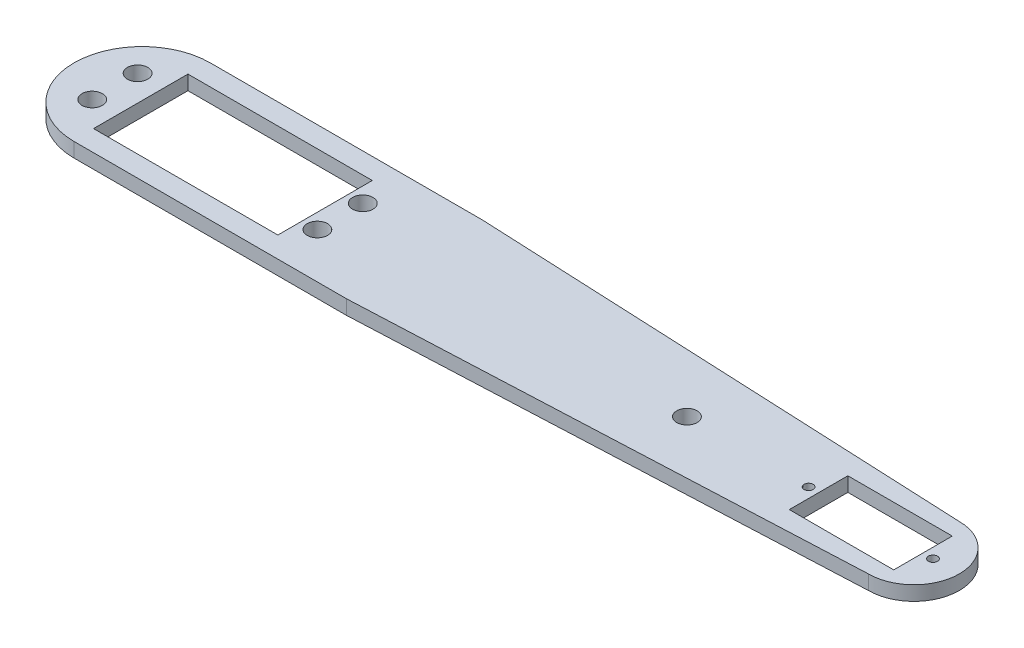
ISO-10303-21;
HEADER;
FILE_DESCRIPTION(('STEP AP214'),'2;1');
FILE_NAME('part.step','',(''),(''),'','','');
FILE_SCHEMA(('AUTOMOTIVE_DESIGN { 1 0 10303 214 1 1 1 1 }'));
ENDSEC;
DATA;
#1=APPLICATION_CONTEXT('core data for automotive mechanical design processes');
#2=APPLICATION_PROTOCOL_DEFINITION('international standard','automotive_design',2000,#1);
#3=PRODUCT_CONTEXT('',#1,'mechanical');
#4=PRODUCT('Part','Part','',(#3));
#5=PRODUCT_RELATED_PRODUCT_CATEGORY('part','',(#4));
#6=PRODUCT_DEFINITION_FORMATION('','',#4);
#7=PRODUCT_DEFINITION_CONTEXT('part definition',#1,'design');
#8=PRODUCT_DEFINITION('design','',#6,#7);
#9=PRODUCT_DEFINITION_SHAPE('','',#8);
#10=(LENGTH_UNIT() NAMED_UNIT(*) SI_UNIT(.MILLI.,.METRE.));
#11=(NAMED_UNIT(*) PLANE_ANGLE_UNIT() SI_UNIT($,.RADIAN.));
#12=(NAMED_UNIT(*) SI_UNIT($,.STERADIAN.) SOLID_ANGLE_UNIT());
#13=UNCERTAINTY_MEASURE_WITH_UNIT(LENGTH_MEASURE(1.E-05),#10,'distance_accuracy_value','');
#14=(GEOMETRIC_REPRESENTATION_CONTEXT(3) GLOBAL_UNCERTAINTY_ASSIGNED_CONTEXT((#13)) GLOBAL_UNIT_ASSIGNED_CONTEXT((#10,
#11,#12)) REPRESENTATION_CONTEXT('',''));
#15=CARTESIAN_POINT('',(0.,0.,0.));
#16=DIRECTION('',(0.,0.,1.));
#17=DIRECTION('',(1.,0.,0.));
#18=AXIS2_PLACEMENT_3D('',#15,#16,#17);
#19=CARTESIAN_POINT('',(-162.387355879804,3.175,-2.24465289077099));
#20=DIRECTION('',(0.,1.,0.));
#21=DIRECTION('',(0.,0.,1.));
#22=AXIS2_PLACEMENT_3D('',#19,#20,#21);
#23=PLANE('',#22);
#24=CARTESIAN_POINT('',(11.812644120196,3.175,-2.244652890771));
#25=DIRECTION('',(0.,1.,0.));
#26=DIRECTION('',(0.,0.,1.));
#27=AXIS2_PLACEMENT_3D('',#24,#25,#26);
#28=CIRCLE('',#27,1.);
#29=CARTESIAN_POINT('',(11.812644120196,3.175,-1.244652890771));
#30=VERTEX_POINT('',#29);
#31=EDGE_CURVE('E383',#30,#30,#28,.T.);
#32=ORIENTED_EDGE('',*,*,#31,.F.);
#33=EDGE_LOOP('',(#32));
#34=FACE_BOUND('',#33,.T.);
#35=DIRECTION('',(-1.,0.,0.));
#36=VECTOR('',#35,1.);
#37=CARTESIAN_POINT('',(-13.387355879804,3.175,-8.69465289077099));
#38=LINE('',#37,#36);
#39=CARTESIAN_POINT('',(9.61264412019603,3.175,-8.69465289077099));
#40=VERTEX_POINT('',#39);
#41=CARTESIAN_POINT('',(-13.387355879804,3.175,-8.69465289077099));
#42=VERTEX_POINT('',#41);
#43=EDGE_CURVE('E144',#40,#42,#38,.T.);
#44=ORIENTED_EDGE('',*,*,#43,.F.);
#45=DIRECTION('',(0.,0.,-1.));
#46=VECTOR('',#45,1.);
#47=CARTESIAN_POINT('',(9.61264412019603,3.175,-8.69465289077099));
#48=LINE('',#47,#46);
#49=CARTESIAN_POINT('',(9.61264412019603,3.175,4.20534710922901));
#50=VERTEX_POINT('',#49);
#51=EDGE_CURVE('E136',#50,#40,#48,.T.);
#52=ORIENTED_EDGE('',*,*,#51,.F.);
#53=DIRECTION('',(1.,0.,0.));
#54=VECTOR('',#53,1.);
#55=CARTESIAN_POINT('',(-13.387355879804,3.175,4.20534710922901));
#56=LINE('',#55,#54);
#57=CARTESIAN_POINT('',(-13.387355879804,3.175,4.20534710922901));
#58=VERTEX_POINT('',#57);
#59=EDGE_CURVE('E159',#58,#50,#56,.T.);
#60=ORIENTED_EDGE('',*,*,#59,.F.);
#61=DIRECTION('',(0.,0.,1.));
#62=VECTOR('',#61,1.);
#63=CARTESIAN_POINT('',(-13.387355879804,3.175,-8.69465289077099));
#64=LINE('',#63,#62);
#65=EDGE_CURVE('E157',#42,#58,#64,.T.);
#66=ORIENTED_EDGE('',*,*,#65,.F.);
#67=EDGE_LOOP('',(#44,#52,#60,#66));
#68=FACE_BOUND('',#67,.T.);
#69=CARTESIAN_POINT('',(-118.787355879804,3.175,2.75534710922901));
#70=DIRECTION('',(0.,1.,0.));
#71=DIRECTION('',(0.,0.,1.));
#72=AXIS2_PLACEMENT_3D('',#69,#70,#71);
#73=CIRCLE('',#72,2.25);
#74=CARTESIAN_POINT('',(-118.787355879804,3.175,5.00534710922901));
#75=VERTEX_POINT('',#74);
#76=EDGE_CURVE('E175',#75,#75,#73,.T.);
#77=ORIENTED_EDGE('',*,*,#76,.F.);
#78=EDGE_LOOP('',(#77));
#79=FACE_BOUND('',#78,.T.);
#80=CARTESIAN_POINT('',(-168.387355879804,3.175,-7.24465289077099));
#81=DIRECTION('',(0.,1.,0.));
#82=DIRECTION('',(0.,0.,1.));
#83=AXIS2_PLACEMENT_3D('',#80,#81,#82);
#84=CIRCLE('',#83,2.25000000000001);
#85=CARTESIAN_POINT('',(-168.387355879804,3.175,-4.99465289077098));
#86=VERTEX_POINT('',#85);
#87=EDGE_CURVE('E187',#86,#86,#84,.T.);
#88=ORIENTED_EDGE('',*,*,#87,.F.);
#89=EDGE_LOOP('',(#88));
#90=FACE_BOUND('',#89,.T.);
#91=DIRECTION('',(1.,0.,0.));
#92=VECTOR('',#91,1.);
#93=CARTESIAN_POINT('',(-162.692621678717,3.175,8.15534710922901));
#94=LINE('',#93,#92);
#95=CARTESIAN_POINT('',(-162.692621678717,3.175,8.15534710922901));
#96=VERTEX_POINT('',#95);
#97=CARTESIAN_POINT('',(-122.092621678717,3.175,8.15534710922901));
#98=VERTEX_POINT('',#97);
#99=EDGE_CURVE('E201',#96,#98,#94,.T.);
#100=ORIENTED_EDGE('',*,*,#99,.F.);
#101=DIRECTION('',(0.,0.,1.));
#102=VECTOR('',#101,1.);
#103=CARTESIAN_POINT('',(-162.692621678717,3.175,8.15534710922901));
#104=LINE('',#103,#102);
#105=CARTESIAN_POINT('',(-162.692621678717,3.175,-12.644652890771));
#106=VERTEX_POINT('',#105);
#107=EDGE_CURVE('E199',#106,#96,#104,.T.);
#108=ORIENTED_EDGE('',*,*,#107,.F.);
#109=DIRECTION('',(-1.,0.,0.));
#110=VECTOR('',#109,1.);
#111=CARTESIAN_POINT('',(-162.692621678717,3.175,-12.644652890771));
#112=LINE('',#111,#110);
#113=CARTESIAN_POINT('',(-122.092621678717,3.175,-12.644652890771));
#114=VERTEX_POINT('',#113);
#115=EDGE_CURVE('E207',#114,#106,#112,.T.);
#116=ORIENTED_EDGE('',*,*,#115,.F.);
#117=DIRECTION('',(0.,0.,-1.));
#118=VECTOR('',#117,1.);
#119=CARTESIAN_POINT('',(-122.092621678717,3.175,8.15534710922901));
#120=LINE('',#119,#118);
#121=EDGE_CURVE('E204',#98,#114,#120,.T.);
#122=ORIENTED_EDGE('',*,*,#121,.F.);
#123=EDGE_LOOP('',(#100,#108,#116,#122));
#124=FACE_BOUND('',#123,.T.);
#125=CARTESIAN_POINT('',(-162.387355879804,3.175,-2.24465289077099));
#126=DIRECTION('',(0.,1.,0.));
#127=DIRECTION('',(0.,0.,1.));
#128=AXIS2_PLACEMENT_3D('',#125,#126,#127);
#129=CIRCLE('',#128,15.);
#130=CARTESIAN_POINT('',(-162.387355879804,3.175,-17.244652890771));
#131=VERTEX_POINT('',#130);
#132=CARTESIAN_POINT('',(-162.387355879804,3.175,12.755347109229));
#133=VERTEX_POINT('',#132);
#134=EDGE_CURVE('E230',#131,#133,#129,.T.);
#135=ORIENTED_EDGE('',*,*,#134,.T.);
#136=DIRECTION('',(1.,0.,0.));
#137=VECTOR('',#136,1.);
#138=CARTESIAN_POINT('',(-162.387355879804,3.175,12.755347109229));
#139=LINE('',#138,#137);
#140=CARTESIAN_POINT('',(-102.387355879804,3.175,12.755347109229));
#141=VERTEX_POINT('',#140);
#142=EDGE_CURVE('E233',#133,#141,#139,.T.);
#143=ORIENTED_EDGE('',*,*,#142,.T.);
#144=DIRECTION('',(0.9989685402103,0.,-0.04540766091865));
#145=VECTOR('',#144,1.);
#146=CARTESIAN_POINT('',(-102.387355879804,3.175,12.755347109229));
#147=LINE('',#146,#145);
#148=CARTESIAN_POINT('',(7.61264412019603,3.175,7.75534710922901));
#149=VERTEX_POINT('',#148);
#150=EDGE_CURVE('E236',#141,#149,#147,.T.);
#151=ORIENTED_EDGE('',*,*,#150,.T.);
#152=CARTESIAN_POINT('',(7.61264412019603,3.175,-2.24465289077099));
#153=DIRECTION('',(0.,1.,0.));
#154=DIRECTION('',(0.,0.,1.));
#155=AXIS2_PLACEMENT_3D('',#152,#153,#154);
#156=CIRCLE('',#155,10.);
#157=CARTESIAN_POINT('',(7.61264412019603,3.175,-12.244652890771));
#158=VERTEX_POINT('',#157);
#159=EDGE_CURVE('E238',#149,#158,#156,.T.);
#160=ORIENTED_EDGE('',*,*,#159,.T.);
#161=DIRECTION('',(-0.998968540210299,0.,-0.04540766091865));
#162=VECTOR('',#161,1.);
#163=CARTESIAN_POINT('',(-102.387355879804,3.175,-17.244652890771));
#164=LINE('',#163,#162);
#165=CARTESIAN_POINT('',(-102.387355879804,3.175,-17.244652890771));
#166=VERTEX_POINT('',#165);
#167=EDGE_CURVE('E240',#158,#166,#164,.T.);
#168=ORIENTED_EDGE('',*,*,#167,.T.);
#169=DIRECTION('',(-1.,0.,0.));
#170=VECTOR('',#169,1.);
#171=CARTESIAN_POINT('',(-162.387355879804,3.175,-17.244652890771));
#172=LINE('',#171,#170);
#173=EDGE_CURVE('E242',#166,#131,#172,.T.);
#174=ORIENTED_EDGE('',*,*,#173,.T.);
#175=EDGE_LOOP('',(#135,#143,#151,#160,#168,#174));
#176=FACE_BOUND('',#175,.T.);
#177=CARTESIAN_POINT('',(-168.387355879804,3.175,2.75534710922901));
#178=DIRECTION('',(0.,1.,0.));
#179=DIRECTION('',(0.,0.,1.));
#180=AXIS2_PLACEMENT_3D('',#177,#178,#179);
#181=CIRCLE('',#180,2.25000000000001);
#182=CARTESIAN_POINT('',(-168.387355879804,3.175,5.00534710922902));
#183=VERTEX_POINT('',#182);
#184=EDGE_CURVE('E193',#183,#183,#181,.T.);
#185=ORIENTED_EDGE('',*,*,#184,.F.);
#186=EDGE_LOOP('',(#185));
#187=FACE_BOUND('',#186,.T.);
#188=CARTESIAN_POINT('',(-118.787355879804,3.175,-7.24465289077099));
#189=DIRECTION('',(0.,1.,0.));
#190=DIRECTION('',(0.,0.,1.));
#191=AXIS2_PLACEMENT_3D('',#188,#189,#190);
#192=CIRCLE('',#191,2.25);
#193=CARTESIAN_POINT('',(-118.787355879804,3.175,-4.994652890771));
#194=VERTEX_POINT('',#193);
#195=EDGE_CURVE('E181',#194,#194,#192,.T.);
#196=ORIENTED_EDGE('',*,*,#195,.F.);
#197=EDGE_LOOP('',(#196));
#198=FACE_BOUND('',#197,.T.);
#199=CARTESIAN_POINT('',(-15.587355879804,3.175,-2.24465289077099));
#200=DIRECTION('',(0.,1.,0.));
#201=DIRECTION('',(0.,0.,1.));
#202=AXIS2_PLACEMENT_3D('',#199,#200,#201);
#203=CIRCLE('',#202,1.);
#204=CARTESIAN_POINT('',(-15.587355879804,3.175,-1.24465289077099));
#205=VERTEX_POINT('',#204);
#206=EDGE_CURVE('E165',#205,#205,#203,.T.);
#207=ORIENTED_EDGE('',*,*,#206,.F.);
#208=EDGE_LOOP('',(#207));
#209=FACE_BOUND('',#208,.T.);
#210=CARTESIAN_POINT('',(-42.387355879804,3.175,-2.24465289077099));
#211=DIRECTION('',(0.,1.,0.));
#212=DIRECTION('',(0.,0.,1.));
#213=AXIS2_PLACEMENT_3D('',#210,#211,#212);
#214=CIRCLE('',#213,2.25);
#215=CARTESIAN_POINT('',(-42.387355879804,3.175,0.00534710922901142));
#216=VERTEX_POINT('',#215);
#217=EDGE_CURVE('E374',#216,#216,#214,.T.);
#218=ORIENTED_EDGE('',*,*,#217,.F.);
#219=EDGE_LOOP('',(#218));
#220=FACE_BOUND('',#219,.T.);
#221=ADVANCED_FACE('F35',(#34,#68,#79,#90,#124,#176,#187,#198,#209,#220),#23,.T.);
#222=CARTESIAN_POINT('',(-162.387355879804,0.,-2.24465289077099));
#223=DIRECTION('',(0.,1.,0.));
#224=DIRECTION('',(0.,0.,1.));
#225=AXIS2_PLACEMENT_3D('',#222,#223,#224);
#226=PLANE('',#225);
#227=CARTESIAN_POINT('',(-118.787355879804,0.,2.75534710922901));
#228=DIRECTION('',(0.,1.,0.));
#229=DIRECTION('',(0.,0.,1.));
#230=AXIS2_PLACEMENT_3D('',#227,#228,#229);
#231=CIRCLE('',#230,2.25);
#232=CARTESIAN_POINT('',(-118.787355879804,0.,5.00534710922901));
#233=VERTEX_POINT('',#232);
#234=EDGE_CURVE('E152',#233,#233,#231,.T.);
#235=ORIENTED_EDGE('',*,*,#234,.T.);
#236=EDGE_LOOP('',(#235));
#237=FACE_BOUND('',#236,.T.);
#238=CARTESIAN_POINT('',(-118.787355879804,0.,-7.24465289077099));
#239=DIRECTION('',(0.,1.,0.));
#240=DIRECTION('',(0.,0.,1.));
#241=AXIS2_PLACEMENT_3D('',#238,#239,#240);
#242=CIRCLE('',#241,2.25);
#243=CARTESIAN_POINT('',(-118.787355879804,0.,-4.994652890771));
#244=VERTEX_POINT('',#243);
#245=EDGE_CURVE('E178',#244,#244,#242,.T.);
#246=ORIENTED_EDGE('',*,*,#245,.T.);
#247=EDGE_LOOP('',(#246));
#248=FACE_BOUND('',#247,.T.);
#249=CARTESIAN_POINT('',(-168.387355879804,0.,-7.24465289077099));
#250=DIRECTION('',(0.,1.,0.));
#251=DIRECTION('',(0.,0.,1.));
#252=AXIS2_PLACEMENT_3D('',#249,#250,#251);
#253=CIRCLE('',#252,2.25000000000001);
#254=CARTESIAN_POINT('',(-168.387355879804,0.,-4.99465289077098));
#255=VERTEX_POINT('',#254);
#256=EDGE_CURVE('E184',#255,#255,#253,.T.);
#257=ORIENTED_EDGE('',*,*,#256,.T.);
#258=EDGE_LOOP('',(#257));
#259=FACE_BOUND('',#258,.T.);
#260=CARTESIAN_POINT('',(-168.387355879804,0.,2.75534710922901));
#261=DIRECTION('',(0.,1.,0.));
#262=DIRECTION('',(0.,0.,1.));
#263=AXIS2_PLACEMENT_3D('',#260,#261,#262);
#264=CIRCLE('',#263,2.25000000000001);
#265=CARTESIAN_POINT('',(-168.387355879804,0.,5.00534710922902));
#266=VERTEX_POINT('',#265);
#267=EDGE_CURVE('E190',#266,#266,#264,.T.);
#268=ORIENTED_EDGE('',*,*,#267,.T.);
#269=EDGE_LOOP('',(#268));
#270=FACE_BOUND('',#269,.T.);
#271=DIRECTION('',(0.,0.,1.));
#272=VECTOR('',#271,1.);
#273=CARTESIAN_POINT('',(-162.692621678717,0.,8.15534710922901));
#274=LINE('',#273,#272);
#275=CARTESIAN_POINT('',(-162.692621678717,0.,-12.644652890771));
#276=VERTEX_POINT('',#275);
#277=CARTESIAN_POINT('',(-162.692621678717,0.,8.15534710922901));
#278=VERTEX_POINT('',#277);
#279=EDGE_CURVE('E196',#276,#278,#274,.T.);
#280=ORIENTED_EDGE('',*,*,#279,.T.);
#281=DIRECTION('',(1.,0.,0.));
#282=VECTOR('',#281,1.);
#283=CARTESIAN_POINT('',(-162.692621678717,0.,8.15534710922901));
#284=LINE('',#283,#282);
#285=CARTESIAN_POINT('',(-122.092621678717,0.,8.15534710922901));
#286=VERTEX_POINT('',#285);
#287=EDGE_CURVE('E212',#278,#286,#284,.T.);
#288=ORIENTED_EDGE('',*,*,#287,.T.);
#289=DIRECTION('',(0.,0.,-1.));
#290=VECTOR('',#289,1.);
#291=CARTESIAN_POINT('',(-122.092621678717,0.,8.15534710922901));
#292=LINE('',#291,#290);
#293=CARTESIAN_POINT('',(-122.092621678717,0.,-12.644652890771));
#294=VERTEX_POINT('',#293);
#295=EDGE_CURVE('E215',#286,#294,#292,.T.);
#296=ORIENTED_EDGE('',*,*,#295,.T.);
#297=DIRECTION('',(-1.,0.,0.));
#298=VECTOR('',#297,1.);
#299=CARTESIAN_POINT('',(-162.692621678717,0.,-12.644652890771));
#300=LINE('',#299,#298);
#301=EDGE_CURVE('E202',#294,#276,#300,.T.);
#302=ORIENTED_EDGE('',*,*,#301,.T.);
#303=EDGE_LOOP('',(#280,#288,#296,#302));
#304=FACE_BOUND('',#303,.T.);
#305=CARTESIAN_POINT('',(-162.387355879804,0.,-2.24465289077099));
#306=DIRECTION('',(0.,1.,0.));
#307=DIRECTION('',(0.,0.,1.));
#308=AXIS2_PLACEMENT_3D('',#305,#306,#307);
#309=CIRCLE('',#308,15.);
#310=CARTESIAN_POINT('',(-162.387355879804,0.,-17.244652890771));
#311=VERTEX_POINT('',#310);
#312=CARTESIAN_POINT('',(-162.387355879804,0.,12.755347109229));
#313=VERTEX_POINT('',#312);
#314=EDGE_CURVE('E229',#311,#313,#309,.T.);
#315=ORIENTED_EDGE('',*,*,#314,.F.);
#316=DIRECTION('',(-1.,0.,0.));
#317=VECTOR('',#316,1.);
#318=CARTESIAN_POINT('',(-162.387355879804,0.,-17.244652890771));
#319=LINE('',#318,#317);
#320=CARTESIAN_POINT('',(-102.387355879804,0.,-17.244652890771));
#321=VERTEX_POINT('',#320);
#322=EDGE_CURVE('E234',#321,#311,#319,.T.);
#323=ORIENTED_EDGE('',*,*,#322,.F.);
#324=DIRECTION('',(-0.998968540210299,0.,-0.04540766091865));
#325=VECTOR('',#324,1.);
#326=CARTESIAN_POINT('',(-102.387355879804,0.,-17.244652890771));
#327=LINE('',#326,#325);
#328=CARTESIAN_POINT('',(7.61264412019603,0.,-12.244652890771));
#329=VERTEX_POINT('',#328);
#330=EDGE_CURVE('E253',#329,#321,#327,.T.);
#331=ORIENTED_EDGE('',*,*,#330,.F.);
#332=CARTESIAN_POINT('',(7.61264412019603,0.,-2.24465289077099));
#333=DIRECTION('',(0.,1.,0.));
#334=DIRECTION('',(0.,0.,1.));
#335=AXIS2_PLACEMENT_3D('',#332,#333,#334);
#336=CIRCLE('',#335,10.);
#337=CARTESIAN_POINT('',(7.61264412019603,0.,7.75534710922901));
#338=VERTEX_POINT('',#337);
#339=EDGE_CURVE('E251',#338,#329,#336,.T.);
#340=ORIENTED_EDGE('',*,*,#339,.F.);
#341=DIRECTION('',(0.9989685402103,0.,-0.04540766091865));
#342=VECTOR('',#341,1.);
#343=CARTESIAN_POINT('',(-102.387355879804,0.,12.755347109229));
#344=LINE('',#343,#342);
#345=CARTESIAN_POINT('',(-102.387355879804,0.,12.755347109229));
#346=VERTEX_POINT('',#345);
#347=EDGE_CURVE('E249',#346,#338,#344,.T.);
#348=ORIENTED_EDGE('',*,*,#347,.F.);
#349=DIRECTION('',(1.,0.,0.));
#350=VECTOR('',#349,1.);
#351=CARTESIAN_POINT('',(-162.387355879804,0.,12.755347109229));
#352=LINE('',#351,#350);
#353=EDGE_CURVE('E247',#313,#346,#352,.T.);
#354=ORIENTED_EDGE('',*,*,#353,.F.);
#355=EDGE_LOOP('',(#315,#323,#331,#340,#348,#354));
#356=FACE_BOUND('',#355,.T.);
#357=DIRECTION('',(0.,0.,-1.));
#358=VECTOR('',#357,1.);
#359=CARTESIAN_POINT('',(9.61264412019603,0.,-8.69465289077099));
#360=LINE('',#359,#358);
#361=CARTESIAN_POINT('',(9.61264412019602,0.,4.20534710922901));
#362=VERTEX_POINT('',#361);
#363=CARTESIAN_POINT('',(9.61264412019603,0.,-8.69465289077099));
#364=VERTEX_POINT('',#363);
#365=EDGE_CURVE('E58',#362,#364,#360,.T.);
#366=ORIENTED_EDGE('',*,*,#365,.T.);
#367=DIRECTION('',(-1.,0.,0.));
#368=VECTOR('',#367,1.);
#369=CARTESIAN_POINT('',(-13.387355879804,0.,-8.69465289077099));
#370=LINE('',#369,#368);
#371=CARTESIAN_POINT('',(-13.387355879804,0.,-8.69465289077099));
#372=VERTEX_POINT('',#371);
#373=EDGE_CURVE('E151',#364,#372,#370,.T.);
#374=ORIENTED_EDGE('',*,*,#373,.T.);
#375=DIRECTION('',(0.,0.,1.));
#376=VECTOR('',#375,1.);
#377=CARTESIAN_POINT('',(-13.387355879804,0.,-8.69465289077099));
#378=LINE('',#377,#376);
#379=CARTESIAN_POINT('',(-13.387355879804,0.,4.20534710922901));
#380=VERTEX_POINT('',#379);
#381=EDGE_CURVE('E167',#372,#380,#378,.T.);
#382=ORIENTED_EDGE('',*,*,#381,.T.);
#383=DIRECTION('',(1.,0.,0.));
#384=VECTOR('',#383,1.);
#385=CARTESIAN_POINT('',(-13.387355879804,0.,4.20534710922901));
#386=LINE('',#385,#384);
#387=EDGE_CURVE('E145',#380,#362,#386,.T.);
#388=ORIENTED_EDGE('',*,*,#387,.T.);
#389=EDGE_LOOP('',(#366,#374,#382,#388));
#390=FACE_BOUND('',#389,.T.);
#391=CARTESIAN_POINT('',(-15.587355879804,0.,-2.24465289077099));
#392=DIRECTION('',(0.,1.,0.));
#393=DIRECTION('',(0.,0.,1.));
#394=AXIS2_PLACEMENT_3D('',#391,#392,#393);
#395=CIRCLE('',#394,1.);
#396=CARTESIAN_POINT('',(-15.587355879804,0.,-1.24465289077099));
#397=VERTEX_POINT('',#396);
#398=EDGE_CURVE('E386',#397,#397,#395,.T.);
#399=ORIENTED_EDGE('',*,*,#398,.T.);
#400=EDGE_LOOP('',(#399));
#401=FACE_BOUND('',#400,.T.);
#402=CARTESIAN_POINT('',(11.812644120196,0.,-2.244652890771));
#403=DIRECTION('',(0.,1.,0.));
#404=DIRECTION('',(0.,0.,1.));
#405=AXIS2_PLACEMENT_3D('',#402,#403,#404);
#406=CIRCLE('',#405,1.);
#407=CARTESIAN_POINT('',(11.812644120196,0.,-1.244652890771));
#408=VERTEX_POINT('',#407);
#409=EDGE_CURVE('E380',#408,#408,#406,.T.);
#410=ORIENTED_EDGE('',*,*,#409,.T.);
#411=EDGE_LOOP('',(#410));
#412=FACE_BOUND('',#411,.T.);
#413=CARTESIAN_POINT('',(-42.387355879804,0.,-2.24465289077099));
#414=DIRECTION('',(0.,1.,0.));
#415=DIRECTION('',(0.,0.,1.));
#416=AXIS2_PLACEMENT_3D('',#413,#414,#415);
#417=CIRCLE('',#416,2.25);
#418=CARTESIAN_POINT('',(-42.387355879804,0.,0.00534710922901142));
#419=VERTEX_POINT('',#418);
#420=EDGE_CURVE('E377',#419,#419,#417,.T.);
#421=ORIENTED_EDGE('',*,*,#420,.T.);
#422=EDGE_LOOP('',(#421));
#423=FACE_BOUND('',#422,.T.);
#424=ADVANCED_FACE('F277',(#237,#248,#259,#270,#304,#356,#390,#401,#412,#423),#226,.F.);
#425=CARTESIAN_POINT('',(-162.387355879804,3.175,-2.24465289077099));
#426=DIRECTION('',(0.,-1.,0.));
#427=DIRECTION('',(0.,0.,-1.));
#428=AXIS2_PLACEMENT_3D('',#425,#426,#427);
#429=CYLINDRICAL_SURFACE('',#428,15.);
#430=ORIENTED_EDGE('',*,*,#314,.T.);
#431=DIRECTION('',(0.,-1.,0.));
#432=VECTOR('',#431,1.);
#433=CARTESIAN_POINT('',(-162.387355879804,3.175,12.755347109229));
#434=LINE('',#433,#432);
#435=EDGE_CURVE('E11',#133,#313,#434,.T.);
#436=ORIENTED_EDGE('',*,*,#435,.F.);
#437=ORIENTED_EDGE('',*,*,#134,.F.);
#438=DIRECTION('',(0.,-1.,0.));
#439=VECTOR('',#438,1.);
#440=CARTESIAN_POINT('',(-162.387355879804,3.175,-17.244652890771));
#441=LINE('',#440,#439);
#442=EDGE_CURVE('E244',#131,#311,#441,.T.);
#443=ORIENTED_EDGE('',*,*,#442,.T.);
#444=EDGE_LOOP('',(#430,#436,#437,#443));
#445=FACE_BOUND('',#444,.T.);
#446=ADVANCED_FACE('F37',(#445),#429,.T.);
#447=CARTESIAN_POINT('',(-162.387355879804,3.175,12.755347109229));
#448=DIRECTION('',(0.,0.,-1.));
#449=DIRECTION('',(-1.,0.,0.));
#450=AXIS2_PLACEMENT_3D('',#447,#448,#449);
#451=PLANE('',#450);
#452=ORIENTED_EDGE('',*,*,#353,.T.);
#453=DIRECTION('',(0.,-1.,0.));
#454=VECTOR('',#453,1.);
#455=CARTESIAN_POINT('',(-102.387355879804,3.175,12.755347109229));
#456=LINE('',#455,#454);
#457=EDGE_CURVE('E43',#141,#346,#456,.T.);
#458=ORIENTED_EDGE('',*,*,#457,.F.);
#459=ORIENTED_EDGE('',*,*,#142,.F.);
#460=ORIENTED_EDGE('',*,*,#435,.T.);
#461=EDGE_LOOP('',(#452,#458,#459,#460));
#462=FACE_BOUND('',#461,.T.);
#463=ADVANCED_FACE('F295',(#462),#451,.F.);
#464=CARTESIAN_POINT('',(-102.387355879804,3.175,12.755347109229));
#465=DIRECTION('',(-0.04540766091865,0.,-0.9989685402103));
#466=DIRECTION('',(-0.9989685402103,0.,0.04540766091865));
#467=AXIS2_PLACEMENT_3D('',#464,#465,#466);
#468=PLANE('',#467);
#469=ORIENTED_EDGE('',*,*,#347,.T.);
#470=DIRECTION('',(0.,-1.,0.));
#471=VECTOR('',#470,1.);
#472=CARTESIAN_POINT('',(7.61264412019603,3.175,7.75534710922901));
#473=LINE('',#472,#471);
#474=EDGE_CURVE('E264',#149,#338,#473,.T.);
#475=ORIENTED_EDGE('',*,*,#474,.F.);
#476=ORIENTED_EDGE('',*,*,#150,.F.);
#477=ORIENTED_EDGE('',*,*,#457,.T.);
#478=EDGE_LOOP('',(#469,#475,#476,#477));
#479=FACE_BOUND('',#478,.T.);
#480=ADVANCED_FACE('F271',(#479),#468,.F.);
#481=CARTESIAN_POINT('',(7.61264412019603,3.175,-2.24465289077099));
#482=DIRECTION('',(0.,-1.,0.));
#483=DIRECTION('',(0.,0.,-1.));
#484=AXIS2_PLACEMENT_3D('',#481,#482,#483);
#485=CYLINDRICAL_SURFACE('',#484,10.);
#486=ORIENTED_EDGE('',*,*,#339,.T.);
#487=DIRECTION('',(0.,-1.,0.));
#488=VECTOR('',#487,1.);
#489=CARTESIAN_POINT('',(7.61264412019603,3.175,-12.244652890771));
#490=LINE('',#489,#488);
#491=EDGE_CURVE('E261',#158,#329,#490,.T.);
#492=ORIENTED_EDGE('',*,*,#491,.F.);
#493=ORIENTED_EDGE('',*,*,#159,.F.);
#494=ORIENTED_EDGE('',*,*,#474,.T.);
#495=EDGE_LOOP('',(#486,#492,#493,#494));
#496=FACE_BOUND('',#495,.T.);
#497=ADVANCED_FACE('F283',(#496),#485,.T.);
#498=CARTESIAN_POINT('',(-102.387355879804,3.175,-17.244652890771));
#499=DIRECTION('',(-0.04540766091865,0.,0.9989685402103));
#500=DIRECTION('',(0.9989685402103,0.,0.04540766091865));
#501=AXIS2_PLACEMENT_3D('',#498,#499,#500);
#502=PLANE('',#501);
#503=ORIENTED_EDGE('',*,*,#330,.T.);
#504=DIRECTION('',(0.,-1.,0.));
#505=VECTOR('',#504,1.);
#506=CARTESIAN_POINT('',(-102.387355879804,3.175,-17.244652890771));
#507=LINE('',#506,#505);
#508=EDGE_CURVE('E258',#166,#321,#507,.T.);
#509=ORIENTED_EDGE('',*,*,#508,.F.);
#510=ORIENTED_EDGE('',*,*,#167,.F.);
#511=ORIENTED_EDGE('',*,*,#491,.T.);
#512=EDGE_LOOP('',(#503,#509,#510,#511));
#513=FACE_BOUND('',#512,.T.);
#514=ADVANCED_FACE('F287',(#513),#502,.F.);
#515=CARTESIAN_POINT('',(-162.387355879804,3.175,-17.244652890771));
#516=DIRECTION('',(0.,0.,1.));
#517=DIRECTION('',(1.,0.,0.));
#518=AXIS2_PLACEMENT_3D('',#515,#516,#517);
#519=PLANE('',#518);
#520=ORIENTED_EDGE('',*,*,#322,.T.);
#521=ORIENTED_EDGE('',*,*,#442,.F.);
#522=ORIENTED_EDGE('',*,*,#173,.F.);
#523=ORIENTED_EDGE('',*,*,#508,.T.);
#524=EDGE_LOOP('',(#520,#521,#522,#523));
#525=FACE_BOUND('',#524,.T.);
#526=ADVANCED_FACE('F298',(#525),#519,.F.);
#527=CARTESIAN_POINT('',(-162.692621678717,3.175,8.15534710922901));
#528=DIRECTION('',(1.,0.,0.));
#529=DIRECTION('',(0.,0.,-1.));
#530=AXIS2_PLACEMENT_3D('',#527,#528,#529);
#531=PLANE('',#530);
#532=ORIENTED_EDGE('',*,*,#279,.F.);
#533=DIRECTION('',(0.,-1.,0.));
#534=VECTOR('',#533,1.);
#535=CARTESIAN_POINT('',(-162.692621678717,3.175,-12.644652890771));
#536=LINE('',#535,#534);
#537=EDGE_CURVE('E209',#106,#276,#536,.T.);
#538=ORIENTED_EDGE('',*,*,#537,.F.);
#539=ORIENTED_EDGE('',*,*,#107,.T.);
#540=DIRECTION('',(0.,-1.,0.));
#541=VECTOR('',#540,1.);
#542=CARTESIAN_POINT('',(-162.692621678717,3.175,8.15534710922901));
#543=LINE('',#542,#541);
#544=EDGE_CURVE('E226',#96,#278,#543,.T.);
#545=ORIENTED_EDGE('',*,*,#544,.T.);
#546=EDGE_LOOP('',(#532,#538,#539,#545));
#547=FACE_BOUND('',#546,.T.);
#548=ADVANCED_FACE('F300',(#547),#531,.T.);
#549=CARTESIAN_POINT('',(-162.692621678717,3.175,8.15534710922901));
#550=DIRECTION('',(0.,0.,-1.));
#551=DIRECTION('',(-1.,0.,0.));
#552=AXIS2_PLACEMENT_3D('',#549,#550,#551);
#553=PLANE('',#552);
#554=ORIENTED_EDGE('',*,*,#287,.F.);
#555=ORIENTED_EDGE('',*,*,#544,.F.);
#556=ORIENTED_EDGE('',*,*,#99,.T.);
#557=DIRECTION('',(0.,-1.,0.));
#558=VECTOR('',#557,1.);
#559=CARTESIAN_POINT('',(-122.092621678717,3.175,8.15534710922901));
#560=LINE('',#559,#558);
#561=EDGE_CURVE('E224',#98,#286,#560,.T.);
#562=ORIENTED_EDGE('',*,*,#561,.T.);
#563=EDGE_LOOP('',(#554,#555,#556,#562));
#564=FACE_BOUND('',#563,.T.);
#565=ADVANCED_FACE('F306',(#564),#553,.T.);
#566=CARTESIAN_POINT('',(-122.092621678717,3.175,8.15534710922901));
#567=DIRECTION('',(-1.,0.,0.));
#568=DIRECTION('',(0.,0.,1.));
#569=AXIS2_PLACEMENT_3D('',#566,#567,#568);
#570=PLANE('',#569);
#571=ORIENTED_EDGE('',*,*,#295,.F.);
#572=ORIENTED_EDGE('',*,*,#561,.F.);
#573=ORIENTED_EDGE('',*,*,#121,.T.);
#574=DIRECTION('',(0.,-1.,0.));
#575=VECTOR('',#574,1.);
#576=CARTESIAN_POINT('',(-122.092621678717,3.175,-12.644652890771));
#577=LINE('',#576,#575);
#578=EDGE_CURVE('E222',#114,#294,#577,.T.);
#579=ORIENTED_EDGE('',*,*,#578,.T.);
#580=EDGE_LOOP('',(#571,#572,#573,#579));
#581=FACE_BOUND('',#580,.T.);
#582=ADVANCED_FACE('F322',(#581),#570,.T.);
#583=CARTESIAN_POINT('',(-162.692621678717,3.175,-12.644652890771));
#584=DIRECTION('',(0.,0.,1.));
#585=DIRECTION('',(1.,0.,0.));
#586=AXIS2_PLACEMENT_3D('',#583,#584,#585);
#587=PLANE('',#586);
#588=ORIENTED_EDGE('',*,*,#301,.F.);
#589=ORIENTED_EDGE('',*,*,#578,.F.);
#590=ORIENTED_EDGE('',*,*,#115,.T.);
#591=ORIENTED_EDGE('',*,*,#537,.T.);
#592=EDGE_LOOP('',(#588,#589,#590,#591));
#593=FACE_BOUND('',#592,.T.);
#594=ADVANCED_FACE('F326',(#593),#587,.T.);
#595=CARTESIAN_POINT('',(-168.387355879804,3.175,2.75534710922901));
#596=DIRECTION('',(0.,-1.,0.));
#597=DIRECTION('',(0.,0.,-1.));
#598=AXIS2_PLACEMENT_3D('',#595,#596,#597);
#599=CYLINDRICAL_SURFACE('',#598,2.25000000000001);
#600=ORIENTED_EDGE('',*,*,#184,.T.);
#601=EDGE_LOOP('',(#600));
#602=FACE_BOUND('',#601,.T.);
#603=ORIENTED_EDGE('',*,*,#267,.F.);
#604=EDGE_LOOP('',(#603));
#605=FACE_BOUND('',#604,.T.);
#606=ADVANCED_FACE('F330',(#602,#605),#599,.F.);
#607=CARTESIAN_POINT('',(-168.387355879804,3.175,-7.24465289077099));
#608=DIRECTION('',(0.,-1.,0.));
#609=DIRECTION('',(0.,0.,-1.));
#610=AXIS2_PLACEMENT_3D('',#607,#608,#609);
#611=CYLINDRICAL_SURFACE('',#610,2.25000000000001);
#612=ORIENTED_EDGE('',*,*,#87,.T.);
#613=EDGE_LOOP('',(#612));
#614=FACE_BOUND('',#613,.T.);
#615=ORIENTED_EDGE('',*,*,#256,.F.);
#616=EDGE_LOOP('',(#615));
#617=FACE_BOUND('',#616,.T.);
#618=ADVANCED_FACE('F334',(#614,#617),#611,.F.);
#619=CARTESIAN_POINT('',(-118.787355879804,3.175,-7.24465289077099));
#620=DIRECTION('',(0.,-1.,0.));
#621=DIRECTION('',(0.,0.,-1.));
#622=AXIS2_PLACEMENT_3D('',#619,#620,#621);
#623=CYLINDRICAL_SURFACE('',#622,2.25);
#624=ORIENTED_EDGE('',*,*,#195,.T.);
#625=EDGE_LOOP('',(#624));
#626=FACE_BOUND('',#625,.T.);
#627=ORIENTED_EDGE('',*,*,#245,.F.);
#628=EDGE_LOOP('',(#627));
#629=FACE_BOUND('',#628,.T.);
#630=ADVANCED_FACE('F338',(#626,#629),#623,.F.);
#631=CARTESIAN_POINT('',(-118.787355879804,3.175,2.75534710922901));
#632=DIRECTION('',(0.,-1.,0.));
#633=DIRECTION('',(0.,0.,-1.));
#634=AXIS2_PLACEMENT_3D('',#631,#632,#633);
#635=CYLINDRICAL_SURFACE('',#634,2.25);
#636=ORIENTED_EDGE('',*,*,#76,.T.);
#637=EDGE_LOOP('',(#636));
#638=FACE_BOUND('',#637,.T.);
#639=ORIENTED_EDGE('',*,*,#234,.F.);
#640=EDGE_LOOP('',(#639));
#641=FACE_BOUND('',#640,.T.);
#642=ADVANCED_FACE('F342',(#638,#641),#635,.F.);
#643=CARTESIAN_POINT('',(9.61264412019603,3.175,-8.69465289077099));
#644=DIRECTION('',(-1.,0.,0.));
#645=DIRECTION('',(0.,0.,1.));
#646=AXIS2_PLACEMENT_3D('',#643,#644,#645);
#647=PLANE('',#646);
#648=ORIENTED_EDGE('',*,*,#365,.F.);
#649=DIRECTION('',(0.,-1.,0.));
#650=VECTOR('',#649,1.);
#651=CARTESIAN_POINT('',(9.61264412019603,3.175,4.20534710922901));
#652=LINE('',#651,#650);
#653=EDGE_CURVE('E140',#50,#362,#652,.T.);
#654=ORIENTED_EDGE('',*,*,#653,.F.);
#655=ORIENTED_EDGE('',*,*,#51,.T.);
#656=DIRECTION('',(0.,-1.,0.));
#657=VECTOR('',#656,1.);
#658=CARTESIAN_POINT('',(9.61264412019603,3.175,-8.69465289077099));
#659=LINE('',#658,#657);
#660=EDGE_CURVE('E139',#40,#364,#659,.T.);
#661=ORIENTED_EDGE('',*,*,#660,.T.);
#662=EDGE_LOOP('',(#648,#654,#655,#661));
#663=FACE_BOUND('',#662,.T.);
#664=ADVANCED_FACE('F138',(#663),#647,.T.);
#665=CARTESIAN_POINT('',(-13.387355879804,3.175,-8.69465289077099));
#666=DIRECTION('',(0.,0.,1.));
#667=DIRECTION('',(1.,0.,0.));
#668=AXIS2_PLACEMENT_3D('',#665,#666,#667);
#669=PLANE('',#668);
#670=ORIENTED_EDGE('',*,*,#373,.F.);
#671=ORIENTED_EDGE('',*,*,#660,.F.);
#672=ORIENTED_EDGE('',*,*,#43,.T.);
#673=DIRECTION('',(0.,-1.,0.));
#674=VECTOR('',#673,1.);
#675=CARTESIAN_POINT('',(-13.387355879804,3.175,-8.69465289077099));
#676=LINE('',#675,#674);
#677=EDGE_CURVE('E153',#42,#372,#676,.T.);
#678=ORIENTED_EDGE('',*,*,#677,.T.);
#679=EDGE_LOOP('',(#670,#671,#672,#678));
#680=FACE_BOUND('',#679,.T.);
#681=ADVANCED_FACE('F148',(#680),#669,.T.);
#682=CARTESIAN_POINT('',(-13.387355879804,3.175,-8.69465289077099));
#683=DIRECTION('',(1.,0.,0.));
#684=DIRECTION('',(0.,0.,-1.));
#685=AXIS2_PLACEMENT_3D('',#682,#683,#684);
#686=PLANE('',#685);
#687=ORIENTED_EDGE('',*,*,#381,.F.);
#688=ORIENTED_EDGE('',*,*,#677,.F.);
#689=ORIENTED_EDGE('',*,*,#65,.T.);
#690=DIRECTION('',(0.,-1.,0.));
#691=VECTOR('',#690,1.);
#692=CARTESIAN_POINT('',(-13.387355879804,3.175,4.20534710922901));
#693=LINE('',#692,#691);
#694=EDGE_CURVE('E50',#58,#380,#693,.T.);
#695=ORIENTED_EDGE('',*,*,#694,.T.);
#696=EDGE_LOOP('',(#687,#688,#689,#695));
#697=FACE_BOUND('',#696,.T.);
#698=ADVANCED_FACE('F351',(#697),#686,.T.);
#699=CARTESIAN_POINT('',(-13.387355879804,3.175,4.20534710922901));
#700=DIRECTION('',(0.,0.,-1.));
#701=DIRECTION('',(-1.,0.,0.));
#702=AXIS2_PLACEMENT_3D('',#699,#700,#701);
#703=PLANE('',#702);
#704=ORIENTED_EDGE('',*,*,#387,.F.);
#705=ORIENTED_EDGE('',*,*,#694,.F.);
#706=ORIENTED_EDGE('',*,*,#59,.T.);
#707=ORIENTED_EDGE('',*,*,#653,.T.);
#708=EDGE_LOOP('',(#704,#705,#706,#707));
#709=FACE_BOUND('',#708,.T.);
#710=ADVANCED_FACE('F354',(#709),#703,.T.);
#711=CARTESIAN_POINT('',(-15.587355879804,3.175,-2.24465289077099));
#712=DIRECTION('',(0.,-1.,0.));
#713=DIRECTION('',(0.,0.,-1.));
#714=AXIS2_PLACEMENT_3D('',#711,#712,#713);
#715=CYLINDRICAL_SURFACE('',#714,1.);
#716=ORIENTED_EDGE('',*,*,#206,.T.);
#717=EDGE_LOOP('',(#716));
#718=FACE_BOUND('',#717,.T.);
#719=ORIENTED_EDGE('',*,*,#398,.F.);
#720=EDGE_LOOP('',(#719));
#721=FACE_BOUND('',#720,.T.);
#722=ADVANCED_FACE('F358',(#718,#721),#715,.F.);
#723=CARTESIAN_POINT('',(11.812644120196,3.175,-2.244652890771));
#724=DIRECTION('',(0.,-1.,0.));
#725=DIRECTION('',(0.,0.,-1.));
#726=AXIS2_PLACEMENT_3D('',#723,#724,#725);
#727=CYLINDRICAL_SURFACE('',#726,1.);
#728=ORIENTED_EDGE('',*,*,#31,.T.);
#729=EDGE_LOOP('',(#728));
#730=FACE_BOUND('',#729,.T.);
#731=ORIENTED_EDGE('',*,*,#409,.F.);
#732=EDGE_LOOP('',(#731));
#733=FACE_BOUND('',#732,.T.);
#734=ADVANCED_FACE('F361',(#730,#733),#727,.F.);
#735=CARTESIAN_POINT('',(-42.387355879804,3.175,-2.24465289077099));
#736=DIRECTION('',(0.,-1.,0.));
#737=DIRECTION('',(0.,0.,-1.));
#738=AXIS2_PLACEMENT_3D('',#735,#736,#737);
#739=CYLINDRICAL_SURFACE('',#738,2.25);
#740=ORIENTED_EDGE('',*,*,#217,.T.);
#741=EDGE_LOOP('',(#740));
#742=FACE_BOUND('',#741,.T.);
#743=ORIENTED_EDGE('',*,*,#420,.F.);
#744=EDGE_LOOP('',(#743));
#745=FACE_BOUND('',#744,.T.);
#746=ADVANCED_FACE('F365',(#742,#745),#739,.F.);
#747=CLOSED_SHELL('',(#221,#424,#446,#463,#480,#497,#514,#526,#548,#565,#582,#594,#606,#618,
#630,#642,#664,#681,#698,#710,#722,#734,#746));
#748=MANIFOLD_SOLID_BREP('B2',#747);
#749=ADVANCED_BREP_SHAPE_REPRESENTATION('',(#18,#748),#14);
#750=SHAPE_DEFINITION_REPRESENTATION(#9,#749);
ENDSEC;
END-ISO-10303-21;
